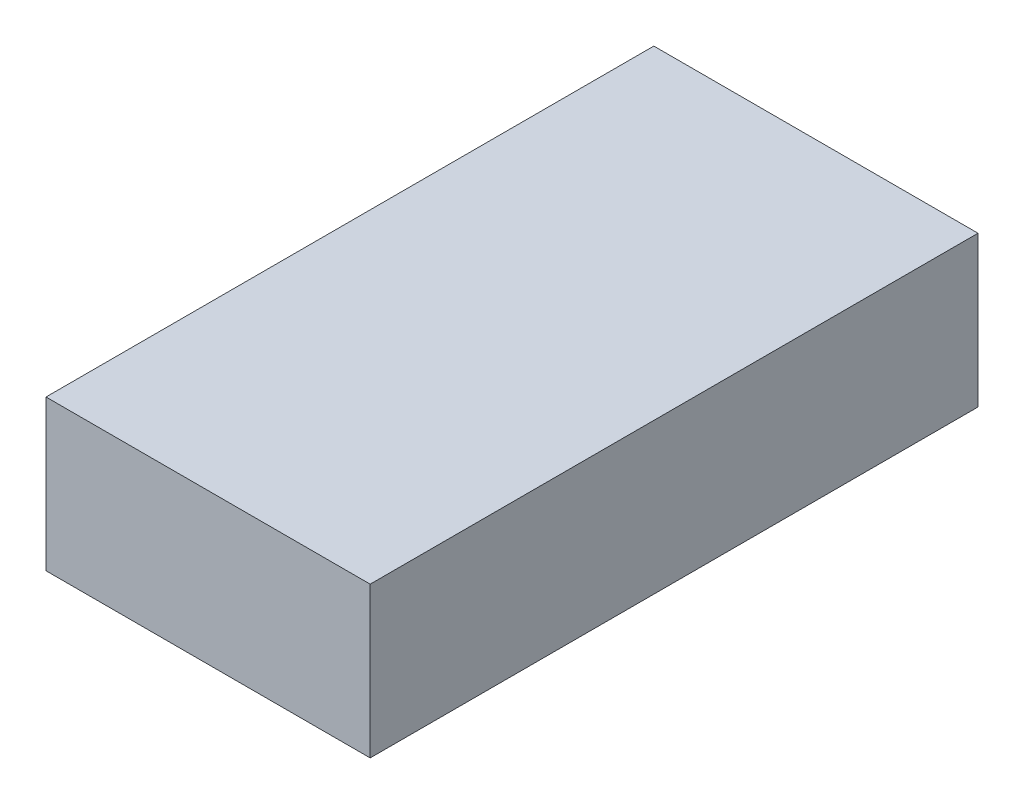
ISO-10303-21;
HEADER;
FILE_DESCRIPTION(('STEP AP214'),'2;1');
FILE_NAME('part.step','',(''),(''),'','','');
FILE_SCHEMA(('AUTOMOTIVE_DESIGN { 1 0 10303 214 1 1 1 1 }'));
ENDSEC;
DATA;
#1=APPLICATION_CONTEXT('core data for automotive mechanical design processes');
#2=APPLICATION_PROTOCOL_DEFINITION('international standard','automotive_design',2000,#1);
#3=PRODUCT_CONTEXT('',#1,'mechanical');
#4=PRODUCT('Part','Part','',(#3));
#5=PRODUCT_RELATED_PRODUCT_CATEGORY('part','',(#4));
#6=PRODUCT_DEFINITION_FORMATION('','',#4);
#7=PRODUCT_DEFINITION_CONTEXT('part definition',#1,'design');
#8=PRODUCT_DEFINITION('design','',#6,#7);
#9=PRODUCT_DEFINITION_SHAPE('','',#8);
#10=(LENGTH_UNIT() NAMED_UNIT(*) SI_UNIT(.MILLI.,.METRE.));
#11=(NAMED_UNIT(*) PLANE_ANGLE_UNIT() SI_UNIT($,.RADIAN.));
#12=(NAMED_UNIT(*) SI_UNIT($,.STERADIAN.) SOLID_ANGLE_UNIT());
#13=UNCERTAINTY_MEASURE_WITH_UNIT(LENGTH_MEASURE(1.E-05),#10,'distance_accuracy_value','');
#14=(GEOMETRIC_REPRESENTATION_CONTEXT(3) GLOBAL_UNCERTAINTY_ASSIGNED_CONTEXT((#13)) GLOBAL_UNIT_ASSIGNED_CONTEXT((#10,
#11,#12)) REPRESENTATION_CONTEXT('',''));
#15=CARTESIAN_POINT('',(0.,0.,0.));
#16=DIRECTION('',(0.,0.,1.));
#17=DIRECTION('',(1.,0.,0.));
#18=AXIS2_PLACEMENT_3D('',#15,#16,#17);
#19=CARTESIAN_POINT('',(-28.,13.,105.));
#20=DIRECTION('',(1.,0.,0.));
#21=DIRECTION('',(0.,1.,0.));
#22=AXIS2_PLACEMENT_3D('',#19,#20,#21);
#23=PLANE('',#22);
#24=DIRECTION('',(0.,-1.,0.));
#25=VECTOR('',#24,1.);
#26=CARTESIAN_POINT('',(-28.,13.,0.));
#27=LINE('',#26,#25);
#28=CARTESIAN_POINT('',(-28.,13.,0.));
#29=VERTEX_POINT('',#28);
#30=CARTESIAN_POINT('',(-28.,-13.,0.));
#31=VERTEX_POINT('',#30);
#32=EDGE_CURVE('E107',#29,#31,#27,.T.);
#33=ORIENTED_EDGE('',*,*,#32,.T.);
#34=DIRECTION('',(0.,0.,-1.));
#35=VECTOR('',#34,1.);
#36=CARTESIAN_POINT('',(-28.,-13.,105.));
#37=LINE('',#36,#35);
#38=CARTESIAN_POINT('',(-28.,-13.,105.));
#39=VERTEX_POINT('',#38);
#40=EDGE_CURVE('E11',#39,#31,#37,.T.);
#41=ORIENTED_EDGE('',*,*,#40,.F.);
#42=DIRECTION('',(0.,-1.,0.));
#43=VECTOR('',#42,1.);
#44=CARTESIAN_POINT('',(-28.,13.,105.));
#45=LINE('',#44,#43);
#46=CARTESIAN_POINT('',(-28.,13.,105.));
#47=VERTEX_POINT('',#46);
#48=EDGE_CURVE('E91',#47,#39,#45,.T.);
#49=ORIENTED_EDGE('',*,*,#48,.F.);
#50=DIRECTION('',(0.,0.,-1.));
#51=VECTOR('',#50,1.);
#52=CARTESIAN_POINT('',(-28.,13.,105.));
#53=LINE('',#52,#51);
#54=EDGE_CURVE('E103',#47,#29,#53,.T.);
#55=ORIENTED_EDGE('',*,*,#54,.T.);
#56=EDGE_LOOP('',(#33,#41,#49,#55));
#57=FACE_BOUND('',#56,.T.);
#58=ADVANCED_FACE('F39',(#57),#23,.F.);
#59=CARTESIAN_POINT('',(-28.,-13.,105.));
#60=DIRECTION('',(0.,1.,0.));
#61=DIRECTION('',(0.,0.,1.));
#62=AXIS2_PLACEMENT_3D('',#59,#60,#61);
#63=PLANE('',#62);
#64=DIRECTION('',(1.,0.,0.));
#65=VECTOR('',#64,1.);
#66=CARTESIAN_POINT('',(-28.,-13.,0.));
#67=LINE('',#66,#65);
#68=CARTESIAN_POINT('',(28.,-13.,0.));
#69=VERTEX_POINT('',#68);
#70=EDGE_CURVE('E96',#31,#69,#67,.T.);
#71=ORIENTED_EDGE('',*,*,#70,.T.);
#72=DIRECTION('',(0.,0.,-1.));
#73=VECTOR('',#72,1.);
#74=CARTESIAN_POINT('',(28.,-13.,105.));
#75=LINE('',#74,#73);
#76=CARTESIAN_POINT('',(28.,-13.,105.));
#77=VERTEX_POINT('',#76);
#78=EDGE_CURVE('E48',#77,#69,#75,.T.);
#79=ORIENTED_EDGE('',*,*,#78,.F.);
#80=DIRECTION('',(1.,0.,0.));
#81=VECTOR('',#80,1.);
#82=CARTESIAN_POINT('',(-28.,-13.,105.));
#83=LINE('',#82,#81);
#84=EDGE_CURVE('E86',#39,#77,#83,.T.);
#85=ORIENTED_EDGE('',*,*,#84,.F.);
#86=ORIENTED_EDGE('',*,*,#40,.T.);
#87=EDGE_LOOP('',(#71,#79,#85,#86));
#88=FACE_BOUND('',#87,.T.);
#89=ADVANCED_FACE('F95',(#88),#63,.F.);
#90=CARTESIAN_POINT('',(28.,13.,105.));
#91=DIRECTION('',(-1.,0.,0.));
#92=DIRECTION('',(0.,0.,1.));
#93=AXIS2_PLACEMENT_3D('',#90,#91,#92);
#94=PLANE('',#93);
#95=DIRECTION('',(0.,1.,0.));
#96=VECTOR('',#95,1.);
#97=CARTESIAN_POINT('',(28.,13.,0.));
#98=LINE('',#97,#96);
#99=CARTESIAN_POINT('',(28.,13.,0.));
#100=VERTEX_POINT('',#99);
#101=EDGE_CURVE('E73',#69,#100,#98,.T.);
#102=ORIENTED_EDGE('',*,*,#101,.T.);
#103=DIRECTION('',(0.,0.,-1.));
#104=VECTOR('',#103,1.);
#105=CARTESIAN_POINT('',(28.,13.,105.));
#106=LINE('',#105,#104);
#107=CARTESIAN_POINT('',(28.,13.,105.));
#108=VERTEX_POINT('',#107);
#109=EDGE_CURVE('E98',#108,#100,#106,.T.);
#110=ORIENTED_EDGE('',*,*,#109,.F.);
#111=DIRECTION('',(0.,1.,0.));
#112=VECTOR('',#111,1.);
#113=CARTESIAN_POINT('',(28.,13.,105.));
#114=LINE('',#113,#112);
#115=EDGE_CURVE('E89',#77,#108,#114,.T.);
#116=ORIENTED_EDGE('',*,*,#115,.F.);
#117=ORIENTED_EDGE('',*,*,#78,.T.);
#118=EDGE_LOOP('',(#102,#110,#116,#117));
#119=FACE_BOUND('',#118,.T.);
#120=ADVANCED_FACE('F99',(#119),#94,.F.);
#121=CARTESIAN_POINT('',(-28.,13.,105.));
#122=DIRECTION('',(0.,-1.,0.));
#123=DIRECTION('',(0.,0.,-1.));
#124=AXIS2_PLACEMENT_3D('',#121,#122,#123);
#125=PLANE('',#124);
#126=DIRECTION('',(-1.,0.,0.));
#127=VECTOR('',#126,1.);
#128=CARTESIAN_POINT('',(-28.,13.,0.));
#129=LINE('',#128,#127);
#130=EDGE_CURVE('E79',#100,#29,#129,.T.);
#131=ORIENTED_EDGE('',*,*,#130,.T.);
#132=ORIENTED_EDGE('',*,*,#54,.F.);
#133=DIRECTION('',(-1.,0.,0.));
#134=VECTOR('',#133,1.);
#135=CARTESIAN_POINT('',(-28.,13.,105.));
#136=LINE('',#135,#134);
#137=EDGE_CURVE('E56',#108,#47,#136,.T.);
#138=ORIENTED_EDGE('',*,*,#137,.F.);
#139=ORIENTED_EDGE('',*,*,#109,.T.);
#140=EDGE_LOOP('',(#131,#132,#138,#139));
#141=FACE_BOUND('',#140,.T.);
#142=ADVANCED_FACE('F120',(#141),#125,.F.);
#143=CARTESIAN_POINT('',(0.,0.,105.));
#144=DIRECTION('',(0.,0.,1.));
#145=DIRECTION('',(1.,0.,0.));
#146=AXIS2_PLACEMENT_3D('',#143,#144,#145);
#147=PLANE('',#146);
#148=ORIENTED_EDGE('',*,*,#48,.T.);
#149=ORIENTED_EDGE('',*,*,#84,.T.);
#150=ORIENTED_EDGE('',*,*,#115,.T.);
#151=ORIENTED_EDGE('',*,*,#137,.T.);
#152=EDGE_LOOP('',(#148,#149,#150,#151));
#153=FACE_BOUND('',#152,.T.);
#154=ADVANCED_FACE('F87',(#153),#147,.T.);
#155=CARTESIAN_POINT('',(0.,0.,0.));
#156=DIRECTION('',(0.,0.,1.));
#157=DIRECTION('',(1.,0.,0.));
#158=AXIS2_PLACEMENT_3D('',#155,#156,#157);
#159=PLANE('',#158);
#160=ORIENTED_EDGE('',*,*,#32,.F.);
#161=ORIENTED_EDGE('',*,*,#130,.F.);
#162=ORIENTED_EDGE('',*,*,#101,.F.);
#163=ORIENTED_EDGE('',*,*,#70,.F.);
#164=EDGE_LOOP('',(#160,#161,#162,#163));
#165=FACE_BOUND('',#164,.T.);
#166=ADVANCED_FACE('F123',(#165),#159,.F.);
#167=CLOSED_SHELL('',(#58,#89,#120,#142,#154,#166));
#168=MANIFOLD_SOLID_BREP('B2',#167);
#169=ADVANCED_BREP_SHAPE_REPRESENTATION('',(#18,#168),#14);
#170=SHAPE_DEFINITION_REPRESENTATION(#9,#169);
ENDSEC;
END-ISO-10303-21;
